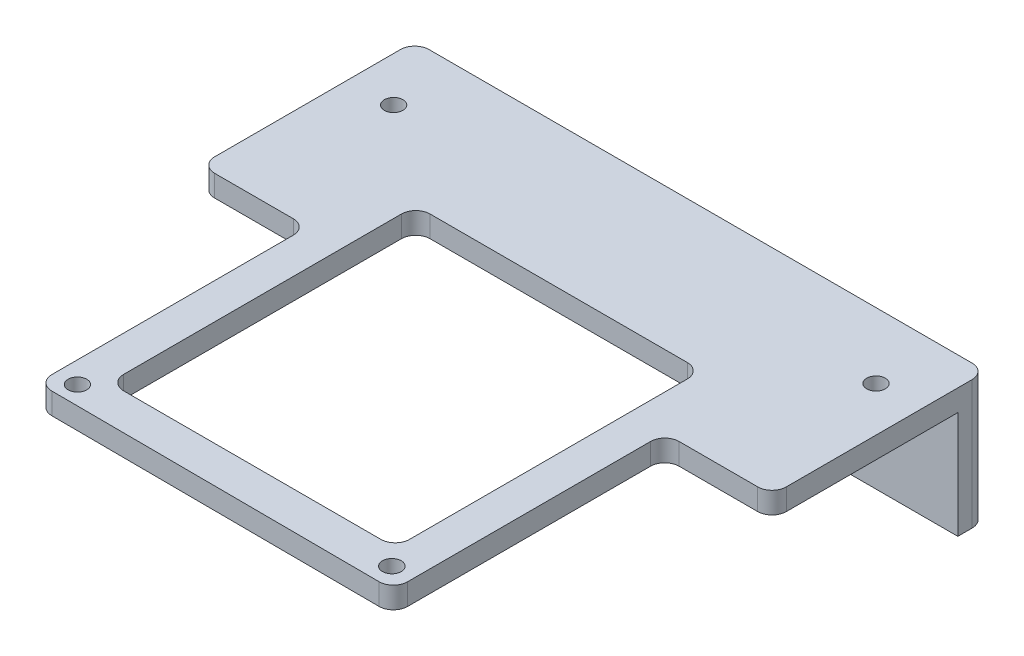
ISO-10303-21;
HEADER;
FILE_DESCRIPTION(('STEP AP214'),'2;1');
FILE_NAME('part.step','',(''),(''),'','','');
FILE_SCHEMA(('AUTOMOTIVE_DESIGN { 1 0 10303 214 1 1 1 1 }'));
ENDSEC;
DATA;
#1=APPLICATION_CONTEXT('core data for automotive mechanical design processes');
#2=APPLICATION_PROTOCOL_DEFINITION('international standard','automotive_design',2000,#1);
#3=PRODUCT_CONTEXT('',#1,'mechanical');
#4=PRODUCT('Part','Part','',(#3));
#5=PRODUCT_RELATED_PRODUCT_CATEGORY('part','',(#4));
#6=PRODUCT_DEFINITION_FORMATION('','',#4);
#7=PRODUCT_DEFINITION_CONTEXT('part definition',#1,'design');
#8=PRODUCT_DEFINITION('design','',#6,#7);
#9=PRODUCT_DEFINITION_SHAPE('','',#8);
#10=(LENGTH_UNIT() NAMED_UNIT(*) SI_UNIT(.MILLI.,.METRE.));
#11=(NAMED_UNIT(*) PLANE_ANGLE_UNIT() SI_UNIT($,.RADIAN.));
#12=(NAMED_UNIT(*) SI_UNIT($,.STERADIAN.) SOLID_ANGLE_UNIT());
#13=UNCERTAINTY_MEASURE_WITH_UNIT(LENGTH_MEASURE(1.E-05),#10,'distance_accuracy_value','');
#14=(GEOMETRIC_REPRESENTATION_CONTEXT(3) GLOBAL_UNCERTAINTY_ASSIGNED_CONTEXT((#13)) GLOBAL_UNIT_ASSIGNED_CONTEXT((#10,
#11,#12)) REPRESENTATION_CONTEXT('',''));
#15=CARTESIAN_POINT('',(0.,0.,0.));
#16=DIRECTION('',(0.,0.,1.));
#17=DIRECTION('',(1.,0.,0.));
#18=AXIS2_PLACEMENT_3D('',#15,#16,#17);
#19=CARTESIAN_POINT('',(38.,-3.,-34.5));
#20=DIRECTION('',(0.,-1.,0.));
#21=DIRECTION('',(0.,0.,-1.));
#22=AXIS2_PLACEMENT_3D('',#19,#20,#21);
#23=PLANE('',#22);
#24=DIRECTION('',(-1.,0.,0.));
#25=VECTOR('',#24,1.);
#26=CARTESIAN_POINT('',(-40.,-3.,-32.5));
#27=LINE('',#26,#25);
#28=CARTESIAN_POINT('',(40.,-3.,-32.5));
#29=VERTEX_POINT('',#28);
#30=CARTESIAN_POINT('',(-40.,-3.,-32.5));
#31=VERTEX_POINT('',#30);
#32=EDGE_CURVE('E54',#29,#31,#27,.T.);
#33=ORIENTED_EDGE('',*,*,#32,.F.);
#34=DIRECTION('',(0.,0.,1.));
#35=VECTOR('',#34,1.);
#36=CARTESIAN_POINT('',(40.,-3.,-34.5));
#37=LINE('',#36,#35);
#38=CARTESIAN_POINT('',(40.,-3.,-8.49999999999999));
#39=VERTEX_POINT('',#38);
#40=EDGE_CURVE('E356',#29,#39,#37,.T.);
#41=ORIENTED_EDGE('',*,*,#40,.T.);
#42=CARTESIAN_POINT('',(38.,-3.,-8.49999999999999));
#43=DIRECTION('',(0.,-1.,0.));
#44=DIRECTION('',(0.,0.,-1.));
#45=AXIS2_PLACEMENT_3D('',#42,#43,#44);
#46=CIRCLE('',#45,2.);
#47=CARTESIAN_POINT('',(38.,-3.,-6.49999999999999));
#48=VERTEX_POINT('',#47);
#49=EDGE_CURVE('E359',#39,#48,#46,.T.);
#50=ORIENTED_EDGE('',*,*,#49,.T.);
#51=DIRECTION('',(-1.,0.,0.));
#52=VECTOR('',#51,1.);
#53=CARTESIAN_POINT('',(38.,-3.,-6.49999999999999));
#54=LINE('',#53,#52);
#55=CARTESIAN_POINT('',(27.,-3.,-6.49999999999999));
#56=VERTEX_POINT('',#55);
#57=EDGE_CURVE('E363',#48,#56,#54,.T.);
#58=ORIENTED_EDGE('',*,*,#57,.T.);
#59=CARTESIAN_POINT('',(27.,-3.,-4.49999999999999));
#60=DIRECTION('',(0.,1.,0.));
#61=DIRECTION('',(0.,0.,-1.));
#62=AXIS2_PLACEMENT_3D('',#59,#60,#61);
#63=CIRCLE('',#62,2.);
#64=CARTESIAN_POINT('',(25.,-3.,-4.49999999999999));
#65=VERTEX_POINT('',#64);
#66=EDGE_CURVE('E366',#56,#65,#63,.T.);
#67=ORIENTED_EDGE('',*,*,#66,.T.);
#68=DIRECTION('',(0.,0.,1.));
#69=VECTOR('',#68,1.);
#70=CARTESIAN_POINT('',(25.,-3.,-4.49999999999999));
#71=LINE('',#70,#69);
#72=CARTESIAN_POINT('',(25.,-3.,29.4906585885515));
#73=VERTEX_POINT('',#72);
#74=EDGE_CURVE('E369',#65,#73,#71,.T.);
#75=ORIENTED_EDGE('',*,*,#74,.T.);
#76=CARTESIAN_POINT('',(23.,-3.,29.4906585885515));
#77=DIRECTION('',(0.,-1.,0.));
#78=DIRECTION('',(0.,0.,1.));
#79=AXIS2_PLACEMENT_3D('',#76,#77,#78);
#80=CIRCLE('',#79,2.);
#81=CARTESIAN_POINT('',(22.9906804038066,-3.,31.4906368747154));
#82=VERTEX_POINT('',#81);
#83=EDGE_CURVE('E372',#73,#82,#80,.T.);
#84=ORIENTED_EDGE('',*,*,#83,.T.);
#85=DIRECTION('',(-0.999989143081913,0.,-0.00465979809667995));
#86=VECTOR('',#85,1.);
#87=CARTESIAN_POINT('',(-23.0093195961933,-3.,31.2762838350547));
#88=LINE('',#87,#86);
#89=CARTESIAN_POINT('',(-23.0093195961933,-3.,31.2762838350547));
#90=VERTEX_POINT('',#89);
#91=EDGE_CURVE('E375',#82,#90,#88,.T.);
#92=ORIENTED_EDGE('',*,*,#91,.T.);
#93=CARTESIAN_POINT('',(-23.,-3.,29.2763055488909));
#94=DIRECTION('',(0.,-1.,0.));
#95=DIRECTION('',(0.,0.,-1.));
#96=AXIS2_PLACEMENT_3D('',#93,#94,#95);
#97=CIRCLE('',#96,2.);
#98=CARTESIAN_POINT('',(-25.,-3.,29.2763055488908));
#99=VERTEX_POINT('',#98);
#100=EDGE_CURVE('E378',#90,#99,#97,.T.);
#101=ORIENTED_EDGE('',*,*,#100,.T.);
#102=DIRECTION('',(0.,0.,-1.));
#103=VECTOR('',#102,1.);
#104=CARTESIAN_POINT('',(-25.,-3.,-4.5));
#105=LINE('',#104,#103);
#106=CARTESIAN_POINT('',(-25.,-3.,-4.5));
#107=VERTEX_POINT('',#106);
#108=EDGE_CURVE('E381',#99,#107,#105,.T.);
#109=ORIENTED_EDGE('',*,*,#108,.T.);
#110=CARTESIAN_POINT('',(-27.,-3.,-4.5));
#111=DIRECTION('',(0.,1.,0.));
#112=DIRECTION('',(0.,0.,1.));
#113=AXIS2_PLACEMENT_3D('',#110,#111,#112);
#114=CIRCLE('',#113,2.);
#115=CARTESIAN_POINT('',(-27.,-3.,-6.5));
#116=VERTEX_POINT('',#115);
#117=EDGE_CURVE('E384',#107,#116,#114,.T.);
#118=ORIENTED_EDGE('',*,*,#117,.T.);
#119=DIRECTION('',(-1.,0.,0.));
#120=VECTOR('',#119,1.);
#121=CARTESIAN_POINT('',(-27.,-3.,-6.5));
#122=LINE('',#121,#120);
#123=CARTESIAN_POINT('',(-38.,-3.,-6.49999999999999));
#124=VERTEX_POINT('',#123);
#125=EDGE_CURVE('E387',#116,#124,#122,.T.);
#126=ORIENTED_EDGE('',*,*,#125,.T.);
#127=CARTESIAN_POINT('',(-38.,-3.,-8.5));
#128=DIRECTION('',(0.,-1.,0.));
#129=DIRECTION('',(0.,0.,-1.));
#130=AXIS2_PLACEMENT_3D('',#127,#128,#129);
#131=CIRCLE('',#130,2.);
#132=CARTESIAN_POINT('',(-40.,-3.,-8.5));
#133=VERTEX_POINT('',#132);
#134=EDGE_CURVE('E390',#124,#133,#131,.T.);
#135=ORIENTED_EDGE('',*,*,#134,.T.);
#136=DIRECTION('',(0.,0.,-1.));
#137=VECTOR('',#136,1.);
#138=CARTESIAN_POINT('',(-40.,-3.,-34.5));
#139=LINE('',#138,#137);
#140=EDGE_CURVE('E393',#133,#31,#139,.T.);
#141=ORIENTED_EDGE('',*,*,#140,.T.);
#142=EDGE_LOOP('',(#33,#41,#50,#58,#67,#75,#84,#92,#101,#109,#118,#126,#135,#141));
#143=FACE_BOUND('',#142,.T.);
#144=CARTESIAN_POINT('',(-18.,-3.,-14.6434212450301));
#145=DIRECTION('',(0.,-1.,0.));
#146=DIRECTION('',(0.,0.,-1.));
#147=AXIS2_PLACEMENT_3D('',#144,#145,#146);
#148=CIRCLE('',#147,2.);
#149=CARTESIAN_POINT('',(-20.,-3.,-14.6434212450301));
#150=VERTEX_POINT('',#149);
#151=CARTESIAN_POINT('',(-18.,-3.,-16.6434212450301));
#152=VERTEX_POINT('',#151);
#153=EDGE_CURVE('E62',#150,#152,#148,.T.);
#154=ORIENTED_EDGE('',*,*,#153,.F.);
#155=DIRECTION('',(0.,0.,-1.));
#156=VECTOR('',#155,1.);
#157=CARTESIAN_POINT('',(-20.,-3.,24.2336647871814));
#158=LINE('',#157,#156);
#159=CARTESIAN_POINT('',(-20.,-3.,24.2336647871814));
#160=VERTEX_POINT('',#159);
#161=EDGE_CURVE('E295',#160,#150,#158,.T.);
#162=ORIENTED_EDGE('',*,*,#161,.F.);
#163=CARTESIAN_POINT('',(-18.,-3.,24.2336647871814));
#164=DIRECTION('',(0.,-1.,0.));
#165=DIRECTION('',(0.,0.,-1.));
#166=AXIS2_PLACEMENT_3D('',#163,#164,#165);
#167=CIRCLE('',#166,2.);
#168=CARTESIAN_POINT('',(-18.,-3.,26.2336647871814));
#169=VERTEX_POINT('',#168);
#170=EDGE_CURVE('E291',#169,#160,#167,.T.);
#171=ORIENTED_EDGE('',*,*,#170,.F.);
#172=DIRECTION('',(-1.,0.,0.));
#173=VECTOR('',#172,1.);
#174=CARTESIAN_POINT('',(-18.,-3.,26.2336647871814));
#175=LINE('',#174,#173);
#176=CARTESIAN_POINT('',(18.,-3.,26.2336647871814));
#177=VERTEX_POINT('',#176);
#178=EDGE_CURVE('E287',#177,#169,#175,.T.);
#179=ORIENTED_EDGE('',*,*,#178,.F.);
#180=CARTESIAN_POINT('',(18.,-3.,24.2336647871814));
#181=DIRECTION('',(0.,-1.,0.));
#182=DIRECTION('',(0.,0.,1.));
#183=AXIS2_PLACEMENT_3D('',#180,#181,#182);
#184=CIRCLE('',#183,2.);
#185=CARTESIAN_POINT('',(20.,-3.,24.2336647871814));
#186=VERTEX_POINT('',#185);
#187=EDGE_CURVE('E284',#186,#177,#184,.T.);
#188=ORIENTED_EDGE('',*,*,#187,.F.);
#189=DIRECTION('',(0.,0.,1.));
#190=VECTOR('',#189,1.);
#191=CARTESIAN_POINT('',(20.,-3.,24.2336647871814));
#192=LINE('',#191,#190);
#193=CARTESIAN_POINT('',(20.,-3.,-14.6434212450301));
#194=VERTEX_POINT('',#193);
#195=EDGE_CURVE('E280',#194,#186,#192,.T.);
#196=ORIENTED_EDGE('',*,*,#195,.F.);
#197=CARTESIAN_POINT('',(18.,-3.,-14.6434212450301));
#198=DIRECTION('',(0.,-1.,0.));
#199=DIRECTION('',(0.,0.,-1.));
#200=AXIS2_PLACEMENT_3D('',#197,#198,#199);
#201=CIRCLE('',#200,2.);
#202=CARTESIAN_POINT('',(18.,-3.,-16.6434212450301));
#203=VERTEX_POINT('',#202);
#204=EDGE_CURVE('E276',#203,#194,#201,.T.);
#205=ORIENTED_EDGE('',*,*,#204,.F.);
#206=DIRECTION('',(1.,0.,0.));
#207=VECTOR('',#206,1.);
#208=CARTESIAN_POINT('',(-18.,-3.,-16.6434212450301));
#209=LINE('',#208,#207);
#210=EDGE_CURVE('E272',#152,#203,#209,.T.);
#211=ORIENTED_EDGE('',*,*,#210,.F.);
#212=EDGE_LOOP('',(#154,#162,#171,#179,#188,#196,#205,#211));
#213=FACE_BOUND('',#212,.T.);
#214=CARTESIAN_POINT('',(33.75,-3.,-27.3));
#215=DIRECTION('',(0.,-1.,0.));
#216=DIRECTION('',(0.,0.,-1.));
#217=AXIS2_PLACEMENT_3D('',#214,#215,#216);
#218=CIRCLE('',#217,1.3);
#219=CARTESIAN_POINT('',(33.75,-3.,-28.6));
#220=VERTEX_POINT('',#219);
#221=EDGE_CURVE('E332',#220,#220,#218,.T.);
#222=ORIENTED_EDGE('',*,*,#221,.F.);
#223=EDGE_LOOP('',(#222));
#224=FACE_BOUND('',#223,.T.);
#225=CARTESIAN_POINT('',(-22.,-3.,28.7));
#226=DIRECTION('',(0.,-1.,0.));
#227=DIRECTION('',(0.,0.,-1.));
#228=AXIS2_PLACEMENT_3D('',#225,#226,#227);
#229=CIRCLE('',#228,1.3);
#230=CARTESIAN_POINT('',(-22.,-3.,27.4));
#231=VERTEX_POINT('',#230);
#232=EDGE_CURVE('E348',#231,#231,#229,.T.);
#233=ORIENTED_EDGE('',*,*,#232,.F.);
#234=EDGE_LOOP('',(#233));
#235=FACE_BOUND('',#234,.T.);
#236=CARTESIAN_POINT('',(-33.75,-3.,-27.3));
#237=DIRECTION('',(0.,-1.,0.));
#238=DIRECTION('',(0.,0.,-1.));
#239=AXIS2_PLACEMENT_3D('',#236,#237,#238);
#240=CIRCLE('',#239,1.3);
#241=CARTESIAN_POINT('',(-33.75,-3.,-28.6));
#242=VERTEX_POINT('',#241);
#243=EDGE_CURVE('E340',#242,#242,#240,.T.);
#244=ORIENTED_EDGE('',*,*,#243,.F.);
#245=EDGE_LOOP('',(#244));
#246=FACE_BOUND('',#245,.T.);
#247=CARTESIAN_POINT('',(22.0090808771113,-3.,28.7123449315462));
#248=DIRECTION('',(0.,-1.,0.));
#249=DIRECTION('',(0.,0.,-1.));
#250=AXIS2_PLACEMENT_3D('',#247,#248,#249);
#251=CIRCLE('',#250,1.31532513177729);
#252=CARTESIAN_POINT('',(22.0090808771113,-3.,27.3970197997689));
#253=VERTEX_POINT('',#252);
#254=EDGE_CURVE('E324',#253,#253,#251,.T.);
#255=ORIENTED_EDGE('',*,*,#254,.F.);
#256=EDGE_LOOP('',(#255));
#257=FACE_BOUND('',#256,.T.);
#258=ADVANCED_FACE('F38',(#143,#213,#224,#235,#246,#257),#23,.T.);
#259=CARTESIAN_POINT('',(38.,0.,-34.5));
#260=DIRECTION('',(0.,-1.,0.));
#261=DIRECTION('',(0.,0.,-1.));
#262=AXIS2_PLACEMENT_3D('',#259,#260,#261);
#263=PLANE('',#262);
#264=DIRECTION('',(0.,0.,-1.));
#265=VECTOR('',#264,1.);
#266=CARTESIAN_POINT('',(-20.,0.,-34.5));
#267=LINE('',#266,#265);
#268=CARTESIAN_POINT('',(-20.,0.,24.2336647871814));
#269=VERTEX_POINT('',#268);
#270=CARTESIAN_POINT('',(-20.,0.,-14.6434212450301));
#271=VERTEX_POINT('',#270);
#272=EDGE_CURVE('E47',#269,#271,#267,.T.);
#273=ORIENTED_EDGE('',*,*,#272,.T.);
#274=CARTESIAN_POINT('',(-18.,0.,-14.6434212450301));
#275=DIRECTION('',(0.,-1.,0.));
#276=DIRECTION('',(0.,0.,-1.));
#277=AXIS2_PLACEMENT_3D('',#274,#275,#276);
#278=CIRCLE('',#277,2.);
#279=CARTESIAN_POINT('',(-18.,0.,-16.6434212450301));
#280=VERTEX_POINT('',#279);
#281=EDGE_CURVE('E11',#271,#280,#278,.T.);
#282=ORIENTED_EDGE('',*,*,#281,.T.);
#283=DIRECTION('',(1.,0.,0.));
#284=VECTOR('',#283,1.);
#285=CARTESIAN_POINT('',(38.,0.,-16.6434212450301));
#286=LINE('',#285,#284);
#287=CARTESIAN_POINT('',(18.,0.,-16.6434212450301));
#288=VERTEX_POINT('',#287);
#289=EDGE_CURVE('E497',#280,#288,#286,.T.);
#290=ORIENTED_EDGE('',*,*,#289,.T.);
#291=CARTESIAN_POINT('',(18.,0.,-14.6434212450301));
#292=DIRECTION('',(0.,-1.,0.));
#293=DIRECTION('',(0.,0.,-1.));
#294=AXIS2_PLACEMENT_3D('',#291,#292,#293);
#295=CIRCLE('',#294,2.);
#296=CARTESIAN_POINT('',(20.,0.,-14.6434212450301));
#297=VERTEX_POINT('',#296);
#298=EDGE_CURVE('E501',#288,#297,#295,.T.);
#299=ORIENTED_EDGE('',*,*,#298,.T.);
#300=DIRECTION('',(0.,0.,1.));
#301=VECTOR('',#300,1.);
#302=CARTESIAN_POINT('',(20.,0.,-34.5));
#303=LINE('',#302,#301);
#304=CARTESIAN_POINT('',(20.,0.,24.2336647871814));
#305=VERTEX_POINT('',#304);
#306=EDGE_CURVE('E505',#297,#305,#303,.T.);
#307=ORIENTED_EDGE('',*,*,#306,.T.);
#308=CARTESIAN_POINT('',(18.,0.,24.2336647871814));
#309=DIRECTION('',(0.,-1.,0.));
#310=DIRECTION('',(0.,0.,-1.));
#311=AXIS2_PLACEMENT_3D('',#308,#309,#310);
#312=CIRCLE('',#311,2.);
#313=CARTESIAN_POINT('',(18.,0.,26.2336647871814));
#314=VERTEX_POINT('',#313);
#315=EDGE_CURVE('E509',#305,#314,#312,.T.);
#316=ORIENTED_EDGE('',*,*,#315,.T.);
#317=DIRECTION('',(-1.,0.,0.));
#318=VECTOR('',#317,1.);
#319=CARTESIAN_POINT('',(38.,0.,26.2336647871814));
#320=LINE('',#319,#318);
#321=CARTESIAN_POINT('',(-18.,0.,26.2336647871814));
#322=VERTEX_POINT('',#321);
#323=EDGE_CURVE('E513',#314,#322,#320,.T.);
#324=ORIENTED_EDGE('',*,*,#323,.T.);
#325=CARTESIAN_POINT('',(-18.,0.,24.2336647871814));
#326=DIRECTION('',(0.,-1.,0.));
#327=DIRECTION('',(0.,0.,-1.));
#328=AXIS2_PLACEMENT_3D('',#325,#326,#327);
#329=CIRCLE('',#328,2.);
#330=EDGE_CURVE('E517',#322,#269,#329,.T.);
#331=ORIENTED_EDGE('',*,*,#330,.T.);
#332=EDGE_LOOP('',(#273,#282,#290,#299,#307,#316,#324,#331));
#333=FACE_BOUND('',#332,.T.);
#334=CARTESIAN_POINT('',(38.,0.,-34.5));
#335=DIRECTION('',(0.,-1.,0.));
#336=DIRECTION('',(0.,0.,-1.));
#337=AXIS2_PLACEMENT_3D('',#334,#335,#336);
#338=CIRCLE('',#337,1.99999999999999);
#339=CARTESIAN_POINT('',(38.,0.,-36.5));
#340=VERTEX_POINT('',#339);
#341=CARTESIAN_POINT('',(40.,0.,-34.5));
#342=VERTEX_POINT('',#341);
#343=EDGE_CURVE('E352',#340,#342,#338,.T.);
#344=ORIENTED_EDGE('',*,*,#343,.F.);
#345=DIRECTION('',(1.,0.,0.));
#346=VECTOR('',#345,1.);
#347=CARTESIAN_POINT('',(38.,0.,-36.5));
#348=LINE('',#347,#346);
#349=CARTESIAN_POINT('',(-38.,0.,-36.5));
#350=VERTEX_POINT('',#349);
#351=EDGE_CURVE('E360',#350,#340,#348,.T.);
#352=ORIENTED_EDGE('',*,*,#351,.F.);
#353=CARTESIAN_POINT('',(-38.,0.,-34.5));
#354=DIRECTION('',(0.,-1.,0.));
#355=DIRECTION('',(0.,0.,1.));
#356=AXIS2_PLACEMENT_3D('',#353,#354,#355);
#357=CIRCLE('',#356,2.00000000000001);
#358=CARTESIAN_POINT('',(-40.,0.,-34.5));
#359=VERTEX_POINT('',#358);
#360=EDGE_CURVE('E438',#359,#350,#357,.T.);
#361=ORIENTED_EDGE('',*,*,#360,.F.);
#362=DIRECTION('',(0.,0.,-1.));
#363=VECTOR('',#362,1.);
#364=CARTESIAN_POINT('',(-40.,0.,-34.5));
#365=LINE('',#364,#363);
#366=CARTESIAN_POINT('',(-40.,0.,-8.5));
#367=VERTEX_POINT('',#366);
#368=EDGE_CURVE('E221',#367,#359,#365,.T.);
#369=ORIENTED_EDGE('',*,*,#368,.F.);
#370=CARTESIAN_POINT('',(-38.,0.,-8.5));
#371=DIRECTION('',(0.,-1.,0.));
#372=DIRECTION('',(0.,0.,-1.));
#373=AXIS2_PLACEMENT_3D('',#370,#371,#372);
#374=CIRCLE('',#373,2.);
#375=CARTESIAN_POINT('',(-38.,0.,-6.49999999999999));
#376=VERTEX_POINT('',#375);
#377=EDGE_CURVE('E433',#376,#367,#374,.T.);
#378=ORIENTED_EDGE('',*,*,#377,.F.);
#379=DIRECTION('',(-1.,0.,0.));
#380=VECTOR('',#379,1.);
#381=CARTESIAN_POINT('',(-27.,0.,-6.5));
#382=LINE('',#381,#380);
#383=CARTESIAN_POINT('',(-27.,0.,-6.5));
#384=VERTEX_POINT('',#383);
#385=EDGE_CURVE('E430',#384,#376,#382,.T.);
#386=ORIENTED_EDGE('',*,*,#385,.F.);
#387=CARTESIAN_POINT('',(-27.,0.,-4.5));
#388=DIRECTION('',(0.,1.,0.));
#389=DIRECTION('',(0.,0.,1.));
#390=AXIS2_PLACEMENT_3D('',#387,#388,#389);
#391=CIRCLE('',#390,2.);
#392=CARTESIAN_POINT('',(-25.,0.,-4.5));
#393=VERTEX_POINT('',#392);
#394=EDGE_CURVE('E427',#393,#384,#391,.T.);
#395=ORIENTED_EDGE('',*,*,#394,.F.);
#396=DIRECTION('',(0.,0.,-1.));
#397=VECTOR('',#396,1.);
#398=CARTESIAN_POINT('',(-25.,0.,-4.5));
#399=LINE('',#398,#397);
#400=CARTESIAN_POINT('',(-25.,0.,29.2763055488908));
#401=VERTEX_POINT('',#400);
#402=EDGE_CURVE('E424',#401,#393,#399,.T.);
#403=ORIENTED_EDGE('',*,*,#402,.F.);
#404=CARTESIAN_POINT('',(-23.,0.,29.2763055488909));
#405=DIRECTION('',(0.,-1.,0.));
#406=DIRECTION('',(0.,0.,-1.));
#407=AXIS2_PLACEMENT_3D('',#404,#405,#406);
#408=CIRCLE('',#407,2.);
#409=CARTESIAN_POINT('',(-23.0093195961933,0.,31.2762838350547));
#410=VERTEX_POINT('',#409);
#411=EDGE_CURVE('E421',#410,#401,#408,.T.);
#412=ORIENTED_EDGE('',*,*,#411,.F.);
#413=DIRECTION('',(-0.999989143081913,0.,-0.00465979809667995));
#414=VECTOR('',#413,1.);
#415=CARTESIAN_POINT('',(-23.0093195961933,0.,31.2762838350547));
#416=LINE('',#415,#414);
#417=CARTESIAN_POINT('',(22.9906804038066,0.,31.4906368747154));
#418=VERTEX_POINT('',#417);
#419=EDGE_CURVE('E418',#418,#410,#416,.T.);
#420=ORIENTED_EDGE('',*,*,#419,.F.);
#421=CARTESIAN_POINT('',(23.,0.,29.4906585885515));
#422=DIRECTION('',(0.,-1.,0.));
#423=DIRECTION('',(0.,0.,1.));
#424=AXIS2_PLACEMENT_3D('',#421,#422,#423);
#425=CIRCLE('',#424,2.);
#426=CARTESIAN_POINT('',(25.,0.,29.4906585885515));
#427=VERTEX_POINT('',#426);
#428=EDGE_CURVE('E415',#427,#418,#425,.T.);
#429=ORIENTED_EDGE('',*,*,#428,.F.);
#430=DIRECTION('',(0.,0.,1.));
#431=VECTOR('',#430,1.);
#432=CARTESIAN_POINT('',(25.,0.,-4.49999999999999));
#433=LINE('',#432,#431);
#434=CARTESIAN_POINT('',(25.,0.,-4.49999999999999));
#435=VERTEX_POINT('',#434);
#436=EDGE_CURVE('E412',#435,#427,#433,.T.);
#437=ORIENTED_EDGE('',*,*,#436,.F.);
#438=CARTESIAN_POINT('',(27.,0.,-4.49999999999999));
#439=DIRECTION('',(0.,1.,0.));
#440=DIRECTION('',(0.,0.,-1.));
#441=AXIS2_PLACEMENT_3D('',#438,#439,#440);
#442=CIRCLE('',#441,2.);
#443=CARTESIAN_POINT('',(27.,0.,-6.49999999999999));
#444=VERTEX_POINT('',#443);
#445=EDGE_CURVE('E409',#444,#435,#442,.T.);
#446=ORIENTED_EDGE('',*,*,#445,.F.);
#447=DIRECTION('',(-1.,0.,0.));
#448=VECTOR('',#447,1.);
#449=CARTESIAN_POINT('',(38.,0.,-6.49999999999999));
#450=LINE('',#449,#448);
#451=CARTESIAN_POINT('',(38.,0.,-6.49999999999999));
#452=VERTEX_POINT('',#451);
#453=EDGE_CURVE('E406',#452,#444,#450,.T.);
#454=ORIENTED_EDGE('',*,*,#453,.F.);
#455=CARTESIAN_POINT('',(38.,0.,-8.49999999999999));
#456=DIRECTION('',(0.,-1.,0.));
#457=DIRECTION('',(0.,0.,-1.));
#458=AXIS2_PLACEMENT_3D('',#455,#456,#457);
#459=CIRCLE('',#458,2.);
#460=CARTESIAN_POINT('',(40.,0.,-8.49999999999999));
#461=VERTEX_POINT('',#460);
#462=EDGE_CURVE('E403',#461,#452,#459,.T.);
#463=ORIENTED_EDGE('',*,*,#462,.F.);
#464=DIRECTION('',(0.,0.,1.));
#465=VECTOR('',#464,1.);
#466=CARTESIAN_POINT('',(40.,0.,-34.5));
#467=LINE('',#466,#465);
#468=EDGE_CURVE('E400',#342,#461,#467,.T.);
#469=ORIENTED_EDGE('',*,*,#468,.F.);
#470=EDGE_LOOP('',(#344,#352,#361,#369,#378,#386,#395,#403,#412,#420,#429,#437,#446,#454,#463,#469));
#471=FACE_BOUND('',#470,.T.);
#472=CARTESIAN_POINT('',(-22.,0.,28.7));
#473=DIRECTION('',(0.,-1.,0.));
#474=DIRECTION('',(0.,0.,-1.));
#475=AXIS2_PLACEMENT_3D('',#472,#473,#474);
#476=CIRCLE('',#475,1.3);
#477=CARTESIAN_POINT('',(-22.,0.,27.4));
#478=VERTEX_POINT('',#477);
#479=EDGE_CURVE('E344',#478,#478,#476,.T.);
#480=ORIENTED_EDGE('',*,*,#479,.T.);
#481=EDGE_LOOP('',(#480));
#482=FACE_BOUND('',#481,.T.);
#483=CARTESIAN_POINT('',(-33.75,0.,-27.3));
#484=DIRECTION('',(0.,-1.,0.));
#485=DIRECTION('',(0.,0.,-1.));
#486=AXIS2_PLACEMENT_3D('',#483,#484,#485);
#487=CIRCLE('',#486,1.3);
#488=CARTESIAN_POINT('',(-33.75,0.,-28.6));
#489=VERTEX_POINT('',#488);
#490=EDGE_CURVE('E336',#489,#489,#487,.T.);
#491=ORIENTED_EDGE('',*,*,#490,.T.);
#492=EDGE_LOOP('',(#491));
#493=FACE_BOUND('',#492,.T.);
#494=CARTESIAN_POINT('',(33.75,0.,-27.3));
#495=DIRECTION('',(0.,-1.,0.));
#496=DIRECTION('',(0.,0.,-1.));
#497=AXIS2_PLACEMENT_3D('',#494,#495,#496);
#498=CIRCLE('',#497,1.3);
#499=CARTESIAN_POINT('',(33.75,0.,-28.6));
#500=VERTEX_POINT('',#499);
#501=EDGE_CURVE('E328',#500,#500,#498,.T.);
#502=ORIENTED_EDGE('',*,*,#501,.T.);
#503=EDGE_LOOP('',(#502));
#504=FACE_BOUND('',#503,.T.);
#505=CARTESIAN_POINT('',(22.0090808771113,0.,28.7123449315462));
#506=DIRECTION('',(0.,-1.,0.));
#507=DIRECTION('',(0.,0.,-1.));
#508=AXIS2_PLACEMENT_3D('',#505,#506,#507);
#509=CIRCLE('',#508,1.31532513177729);
#510=CARTESIAN_POINT('',(22.0090808771113,0.,27.3970197997689));
#511=VERTEX_POINT('',#510);
#512=EDGE_CURVE('E303',#511,#511,#509,.T.);
#513=ORIENTED_EDGE('',*,*,#512,.T.);
#514=EDGE_LOOP('',(#513));
#515=FACE_BOUND('',#514,.T.);
#516=ADVANCED_FACE('F523',(#333,#471,#482,#493,#504,#515),#263,.F.);
#517=CARTESIAN_POINT('',(38.,-3.,-34.5));
#518=DIRECTION('',(0.,1.,0.));
#519=DIRECTION('',(0.,0.,1.));
#520=AXIS2_PLACEMENT_3D('',#517,#518,#519);
#521=CYLINDRICAL_SURFACE('',#520,1.99999999999999);
#522=ORIENTED_EDGE('',*,*,#343,.T.);
#523=DIRECTION('',(0.,1.,0.));
#524=VECTOR('',#523,1.);
#525=CARTESIAN_POINT('',(40.,-3.,-34.5));
#526=LINE('',#525,#524);
#527=CARTESIAN_POINT('',(40.,-18.,-34.5));
#528=VERTEX_POINT('',#527);
#529=EDGE_CURVE('E493',#528,#342,#526,.T.);
#530=ORIENTED_EDGE('',*,*,#529,.F.);
#531=CARTESIAN_POINT('',(38.,-18.,-34.5));
#532=DIRECTION('',(0.,-1.,0.));
#533=DIRECTION('',(0.,0.,-1.));
#534=AXIS2_PLACEMENT_3D('',#531,#532,#533);
#535=CIRCLE('',#534,2.);
#536=CARTESIAN_POINT('',(38.,-18.,-36.5));
#537=VERTEX_POINT('',#536);
#538=EDGE_CURVE('E254',#537,#528,#535,.T.);
#539=ORIENTED_EDGE('',*,*,#538,.F.);
#540=DIRECTION('',(0.,1.,0.));
#541=VECTOR('',#540,1.);
#542=CARTESIAN_POINT('',(38.,-3.,-36.5));
#543=LINE('',#542,#541);
#544=EDGE_CURVE('E396',#537,#340,#543,.T.);
#545=ORIENTED_EDGE('',*,*,#544,.T.);
#546=EDGE_LOOP('',(#522,#530,#539,#545));
#547=FACE_BOUND('',#546,.T.);
#548=ADVANCED_FACE('F40',(#547),#521,.T.);
#549=CARTESIAN_POINT('',(40.,-3.,-34.5));
#550=DIRECTION('',(-1.,0.,0.));
#551=DIRECTION('',(0.,0.,1.));
#552=AXIS2_PLACEMENT_3D('',#549,#550,#551);
#553=PLANE('',#552);
#554=ORIENTED_EDGE('',*,*,#468,.T.);
#555=DIRECTION('',(0.,1.,0.));
#556=VECTOR('',#555,1.);
#557=CARTESIAN_POINT('',(40.,-3.,-8.49999999999999));
#558=LINE('',#557,#556);
#559=EDGE_CURVE('E489',#39,#461,#558,.T.);
#560=ORIENTED_EDGE('',*,*,#559,.F.);
#561=ORIENTED_EDGE('',*,*,#40,.F.);
#562=DIRECTION('',(0.,1.,0.));
#563=VECTOR('',#562,1.);
#564=CARTESIAN_POINT('',(40.,-18.,-32.5));
#565=LINE('',#564,#563);
#566=CARTESIAN_POINT('',(40.,-18.,-32.5));
#567=VERTEX_POINT('',#566);
#568=EDGE_CURVE('E266',#567,#29,#565,.T.);
#569=ORIENTED_EDGE('',*,*,#568,.F.);
#570=DIRECTION('',(0.,0.,1.));
#571=VECTOR('',#570,1.);
#572=CARTESIAN_POINT('',(40.,-18.,-32.5));
#573=LINE('',#572,#571);
#574=EDGE_CURVE('E258',#528,#567,#573,.T.);
#575=ORIENTED_EDGE('',*,*,#574,.F.);
#576=ORIENTED_EDGE('',*,*,#529,.T.);
#577=EDGE_LOOP('',(#554,#560,#561,#569,#575,#576));
#578=FACE_BOUND('',#577,.T.);
#579=ADVANCED_FACE('F616',(#578),#553,.F.);
#580=CARTESIAN_POINT('',(38.,-3.,-8.49999999999999));
#581=DIRECTION('',(0.,1.,0.));
#582=DIRECTION('',(0.,0.,1.));
#583=AXIS2_PLACEMENT_3D('',#580,#581,#582);
#584=CYLINDRICAL_SURFACE('',#583,2.);
#585=ORIENTED_EDGE('',*,*,#462,.T.);
#586=DIRECTION('',(0.,1.,0.));
#587=VECTOR('',#586,1.);
#588=CARTESIAN_POINT('',(38.,-3.,-6.49999999999999));
#589=LINE('',#588,#587);
#590=EDGE_CURVE('E485',#48,#452,#589,.T.);
#591=ORIENTED_EDGE('',*,*,#590,.F.);
#592=ORIENTED_EDGE('',*,*,#49,.F.);
#593=ORIENTED_EDGE('',*,*,#559,.T.);
#594=EDGE_LOOP('',(#585,#591,#592,#593));
#595=FACE_BOUND('',#594,.T.);
#596=ADVANCED_FACE('F613',(#595),#584,.T.);
#597=CARTESIAN_POINT('',(38.,-3.,-6.49999999999999));
#598=DIRECTION('',(0.,0.,-1.));
#599=DIRECTION('',(-1.,0.,0.));
#600=AXIS2_PLACEMENT_3D('',#597,#598,#599);
#601=PLANE('',#600);
#602=ORIENTED_EDGE('',*,*,#453,.T.);
#603=DIRECTION('',(0.,1.,0.));
#604=VECTOR('',#603,1.);
#605=CARTESIAN_POINT('',(27.,-3.,-6.49999999999999));
#606=LINE('',#605,#604);
#607=EDGE_CURVE('E481',#56,#444,#606,.T.);
#608=ORIENTED_EDGE('',*,*,#607,.F.);
#609=ORIENTED_EDGE('',*,*,#57,.F.);
#610=ORIENTED_EDGE('',*,*,#590,.T.);
#611=EDGE_LOOP('',(#602,#608,#609,#610));
#612=FACE_BOUND('',#611,.T.);
#613=ADVANCED_FACE('F609',(#612),#601,.F.);
#614=CARTESIAN_POINT('',(27.,-3.,-4.49999999999999));
#615=DIRECTION('',(0.,1.,0.));
#616=DIRECTION('',(0.,0.,1.));
#617=AXIS2_PLACEMENT_3D('',#614,#615,#616);
#618=CYLINDRICAL_SURFACE('',#617,2.);
#619=ORIENTED_EDGE('',*,*,#445,.T.);
#620=DIRECTION('',(0.,1.,0.));
#621=VECTOR('',#620,1.);
#622=CARTESIAN_POINT('',(25.,-3.,-4.49999999999999));
#623=LINE('',#622,#621);
#624=EDGE_CURVE('E477',#65,#435,#623,.T.);
#625=ORIENTED_EDGE('',*,*,#624,.F.);
#626=ORIENTED_EDGE('',*,*,#66,.F.);
#627=ORIENTED_EDGE('',*,*,#607,.T.);
#628=EDGE_LOOP('',(#619,#625,#626,#627));
#629=FACE_BOUND('',#628,.T.);
#630=ADVANCED_FACE('F605',(#629),#618,.F.);
#631=CARTESIAN_POINT('',(25.,-3.,-4.49999999999999));
#632=DIRECTION('',(-1.,0.,0.));
#633=DIRECTION('',(0.,0.,1.));
#634=AXIS2_PLACEMENT_3D('',#631,#632,#633);
#635=PLANE('',#634);
#636=ORIENTED_EDGE('',*,*,#436,.T.);
#637=DIRECTION('',(0.,1.,0.));
#638=VECTOR('',#637,1.);
#639=CARTESIAN_POINT('',(25.,-3.,29.4906585885515));
#640=LINE('',#639,#638);
#641=EDGE_CURVE('E473',#73,#427,#640,.T.);
#642=ORIENTED_EDGE('',*,*,#641,.F.);
#643=ORIENTED_EDGE('',*,*,#74,.F.);
#644=ORIENTED_EDGE('',*,*,#624,.T.);
#645=EDGE_LOOP('',(#636,#642,#643,#644));
#646=FACE_BOUND('',#645,.T.);
#647=ADVANCED_FACE('F601',(#646),#635,.F.);
#648=CARTESIAN_POINT('',(23.,-3.,29.4906585885515));
#649=DIRECTION('',(0.,1.,0.));
#650=DIRECTION('',(0.,0.,1.));
#651=AXIS2_PLACEMENT_3D('',#648,#649,#650);
#652=CYLINDRICAL_SURFACE('',#651,2.);
#653=ORIENTED_EDGE('',*,*,#428,.T.);
#654=DIRECTION('',(0.,1.,0.));
#655=VECTOR('',#654,1.);
#656=CARTESIAN_POINT('',(22.9906804038066,-3.,31.4906368747154));
#657=LINE('',#656,#655);
#658=EDGE_CURVE('E469',#82,#418,#657,.T.);
#659=ORIENTED_EDGE('',*,*,#658,.F.);
#660=ORIENTED_EDGE('',*,*,#83,.F.);
#661=ORIENTED_EDGE('',*,*,#641,.T.);
#662=EDGE_LOOP('',(#653,#659,#660,#661));
#663=FACE_BOUND('',#662,.T.);
#664=ADVANCED_FACE('F597',(#663),#652,.T.);
#665=CARTESIAN_POINT('',(-23.0093195961933,-3.,31.2762838350547));
#666=DIRECTION('',(0.00465979809667995,0.,-0.999989143081913));
#667=DIRECTION('',(-0.999989143081913,0.,-0.00465979809667995));
#668=AXIS2_PLACEMENT_3D('',#665,#666,#667);
#669=PLANE('',#668);
#670=ORIENTED_EDGE('',*,*,#419,.T.);
#671=DIRECTION('',(0.,1.,0.));
#672=VECTOR('',#671,1.);
#673=CARTESIAN_POINT('',(-23.0093195961933,-3.,31.2762838350547));
#674=LINE('',#673,#672);
#675=EDGE_CURVE('E465',#90,#410,#674,.T.);
#676=ORIENTED_EDGE('',*,*,#675,.F.);
#677=ORIENTED_EDGE('',*,*,#91,.F.);
#678=ORIENTED_EDGE('',*,*,#658,.T.);
#679=EDGE_LOOP('',(#670,#676,#677,#678));
#680=FACE_BOUND('',#679,.T.);
#681=ADVANCED_FACE('F593',(#680),#669,.F.);
#682=CARTESIAN_POINT('',(-23.,-3.,29.2763055488909));
#683=DIRECTION('',(0.,1.,0.));
#684=DIRECTION('',(0.,0.,1.));
#685=AXIS2_PLACEMENT_3D('',#682,#683,#684);
#686=CYLINDRICAL_SURFACE('',#685,2.);
#687=ORIENTED_EDGE('',*,*,#411,.T.);
#688=DIRECTION('',(0.,1.,0.));
#689=VECTOR('',#688,1.);
#690=CARTESIAN_POINT('',(-25.,-3.,29.2763055488908));
#691=LINE('',#690,#689);
#692=EDGE_CURVE('E462',#99,#401,#691,.T.);
#693=ORIENTED_EDGE('',*,*,#692,.F.);
#694=ORIENTED_EDGE('',*,*,#100,.F.);
#695=ORIENTED_EDGE('',*,*,#675,.T.);
#696=EDGE_LOOP('',(#687,#693,#694,#695));
#697=FACE_BOUND('',#696,.T.);
#698=ADVANCED_FACE('F589',(#697),#686,.T.);
#699=CARTESIAN_POINT('',(-25.,-3.,-4.5));
#700=DIRECTION('',(1.,0.,0.));
#701=DIRECTION('',(0.,0.,-1.));
#702=AXIS2_PLACEMENT_3D('',#699,#700,#701);
#703=PLANE('',#702);
#704=ORIENTED_EDGE('',*,*,#402,.T.);
#705=DIRECTION('',(0.,1.,0.));
#706=VECTOR('',#705,1.);
#707=CARTESIAN_POINT('',(-25.,-3.,-4.5));
#708=LINE('',#707,#706);
#709=EDGE_CURVE('E458',#107,#393,#708,.T.);
#710=ORIENTED_EDGE('',*,*,#709,.F.);
#711=ORIENTED_EDGE('',*,*,#108,.F.);
#712=ORIENTED_EDGE('',*,*,#692,.T.);
#713=EDGE_LOOP('',(#704,#710,#711,#712));
#714=FACE_BOUND('',#713,.T.);
#715=ADVANCED_FACE('F585',(#714),#703,.F.);
#716=CARTESIAN_POINT('',(-27.,-3.,-4.5));
#717=DIRECTION('',(0.,1.,0.));
#718=DIRECTION('',(0.,0.,1.));
#719=AXIS2_PLACEMENT_3D('',#716,#717,#718);
#720=CYLINDRICAL_SURFACE('',#719,2.);
#721=ORIENTED_EDGE('',*,*,#394,.T.);
#722=DIRECTION('',(0.,1.,0.));
#723=VECTOR('',#722,1.);
#724=CARTESIAN_POINT('',(-27.,-3.,-6.5));
#725=LINE('',#724,#723);
#726=EDGE_CURVE('E454',#116,#384,#725,.T.);
#727=ORIENTED_EDGE('',*,*,#726,.F.);
#728=ORIENTED_EDGE('',*,*,#117,.F.);
#729=ORIENTED_EDGE('',*,*,#709,.T.);
#730=EDGE_LOOP('',(#721,#727,#728,#729));
#731=FACE_BOUND('',#730,.T.);
#732=ADVANCED_FACE('F581',(#731),#720,.F.);
#733=CARTESIAN_POINT('',(-27.,-3.,-6.5));
#734=DIRECTION('',(0.,0.,-1.));
#735=DIRECTION('',(-1.,0.,0.));
#736=AXIS2_PLACEMENT_3D('',#733,#734,#735);
#737=PLANE('',#736);
#738=ORIENTED_EDGE('',*,*,#385,.T.);
#739=DIRECTION('',(0.,1.,0.));
#740=VECTOR('',#739,1.);
#741=CARTESIAN_POINT('',(-38.,-3.,-6.49999999999999));
#742=LINE('',#741,#740);
#743=EDGE_CURVE('E450',#124,#376,#742,.T.);
#744=ORIENTED_EDGE('',*,*,#743,.F.);
#745=ORIENTED_EDGE('',*,*,#125,.F.);
#746=ORIENTED_EDGE('',*,*,#726,.T.);
#747=EDGE_LOOP('',(#738,#744,#745,#746));
#748=FACE_BOUND('',#747,.T.);
#749=ADVANCED_FACE('F577',(#748),#737,.F.);
#750=CARTESIAN_POINT('',(-38.,-3.,-8.5));
#751=DIRECTION('',(0.,1.,0.));
#752=DIRECTION('',(0.,0.,1.));
#753=AXIS2_PLACEMENT_3D('',#750,#751,#752);
#754=CYLINDRICAL_SURFACE('',#753,2.);
#755=ORIENTED_EDGE('',*,*,#377,.T.);
#756=DIRECTION('',(0.,1.,0.));
#757=VECTOR('',#756,1.);
#758=CARTESIAN_POINT('',(-40.,-3.,-8.5));
#759=LINE('',#758,#757);
#760=EDGE_CURVE('E225',#133,#367,#759,.T.);
#761=ORIENTED_EDGE('',*,*,#760,.F.);
#762=ORIENTED_EDGE('',*,*,#134,.F.);
#763=ORIENTED_EDGE('',*,*,#743,.T.);
#764=EDGE_LOOP('',(#755,#761,#762,#763));
#765=FACE_BOUND('',#764,.T.);
#766=ADVANCED_FACE('F574',(#765),#754,.T.);
#767=CARTESIAN_POINT('',(-40.,-3.,-34.5));
#768=DIRECTION('',(1.,0.,0.));
#769=DIRECTION('',(0.,0.,-1.));
#770=AXIS2_PLACEMENT_3D('',#767,#768,#769);
#771=PLANE('',#770);
#772=ORIENTED_EDGE('',*,*,#368,.T.);
#773=DIRECTION('',(0.,1.,0.));
#774=VECTOR('',#773,1.);
#775=CARTESIAN_POINT('',(-40.,-3.,-34.5));
#776=LINE('',#775,#774);
#777=CARTESIAN_POINT('',(-40.,-18.,-34.5));
#778=VERTEX_POINT('',#777);
#779=EDGE_CURVE('E213',#778,#359,#776,.T.);
#780=ORIENTED_EDGE('',*,*,#779,.F.);
#781=DIRECTION('',(0.,0.,-1.));
#782=VECTOR('',#781,1.);
#783=CARTESIAN_POINT('',(-40.,-18.,-32.5));
#784=LINE('',#783,#782);
#785=CARTESIAN_POINT('',(-40.,-18.,-32.5));
#786=VERTEX_POINT('',#785);
#787=EDGE_CURVE('E218',#786,#778,#784,.T.);
#788=ORIENTED_EDGE('',*,*,#787,.F.);
#789=DIRECTION('',(0.,1.,0.));
#790=VECTOR('',#789,1.);
#791=CARTESIAN_POINT('',(-40.,-18.,-32.5));
#792=LINE('',#791,#790);
#793=EDGE_CURVE('E262',#786,#31,#792,.T.);
#794=ORIENTED_EDGE('',*,*,#793,.T.);
#795=ORIENTED_EDGE('',*,*,#140,.F.);
#796=ORIENTED_EDGE('',*,*,#760,.T.);
#797=EDGE_LOOP('',(#772,#780,#788,#794,#795,#796));
#798=FACE_BOUND('',#797,.T.);
#799=ADVANCED_FACE('F215',(#798),#771,.F.);
#800=CARTESIAN_POINT('',(-38.,-3.,-34.5));
#801=DIRECTION('',(0.,1.,0.));
#802=DIRECTION('',(0.,0.,1.));
#803=AXIS2_PLACEMENT_3D('',#800,#801,#802);
#804=CYLINDRICAL_SURFACE('',#803,2.00000000000001);
#805=ORIENTED_EDGE('',*,*,#360,.T.);
#806=DIRECTION('',(0.,1.,0.));
#807=VECTOR('',#806,1.);
#808=CARTESIAN_POINT('',(-38.,-3.,-36.5));
#809=LINE('',#808,#807);
#810=CARTESIAN_POINT('',(-38.,-18.,-36.5));
#811=VERTEX_POINT('',#810);
#812=EDGE_CURVE('E226',#811,#350,#809,.T.);
#813=ORIENTED_EDGE('',*,*,#812,.F.);
#814=CARTESIAN_POINT('',(-38.,-18.,-34.5));
#815=DIRECTION('',(0.,-1.,0.));
#816=DIRECTION('',(0.,0.,1.));
#817=AXIS2_PLACEMENT_3D('',#814,#815,#816);
#818=CIRCLE('',#817,2.);
#819=EDGE_CURVE('E229',#778,#811,#818,.T.);
#820=ORIENTED_EDGE('',*,*,#819,.F.);
#821=ORIENTED_EDGE('',*,*,#779,.T.);
#822=EDGE_LOOP('',(#805,#813,#820,#821));
#823=FACE_BOUND('',#822,.T.);
#824=ADVANCED_FACE('F230',(#823),#804,.T.);
#825=CARTESIAN_POINT('',(38.,-3.,-36.5));
#826=DIRECTION('',(0.,0.,1.));
#827=DIRECTION('',(1.,0.,0.));
#828=AXIS2_PLACEMENT_3D('',#825,#826,#827);
#829=PLANE('',#828);
#830=CARTESIAN_POINT('',(-25.,-10.5,-36.5));
#831=DIRECTION('',(0.,0.,1.));
#832=DIRECTION('',(1.,0.,0.));
#833=AXIS2_PLACEMENT_3D('',#830,#831,#832);
#834=CIRCLE('',#833,2.2);
#835=CARTESIAN_POINT('',(-22.8,-10.5,-36.5));
#836=VERTEX_POINT('',#835);
#837=EDGE_CURVE('E247',#836,#836,#834,.T.);
#838=ORIENTED_EDGE('',*,*,#837,.T.);
#839=EDGE_LOOP('',(#838));
#840=FACE_BOUND('',#839,.T.);
#841=CARTESIAN_POINT('',(25.,-10.5,-36.5));
#842=DIRECTION('',(0.,0.,1.));
#843=DIRECTION('',(1.,0.,0.));
#844=AXIS2_PLACEMENT_3D('',#841,#842,#843);
#845=CIRCLE('',#844,2.2);
#846=CARTESIAN_POINT('',(27.2,-10.5,-36.5));
#847=VERTEX_POINT('',#846);
#848=EDGE_CURVE('E985',#847,#847,#845,.T.);
#849=ORIENTED_EDGE('',*,*,#848,.T.);
#850=EDGE_LOOP('',(#849));
#851=FACE_BOUND('',#850,.T.);
#852=ORIENTED_EDGE('',*,*,#351,.T.);
#853=ORIENTED_EDGE('',*,*,#544,.F.);
#854=DIRECTION('',(1.,0.,0.));
#855=VECTOR('',#854,1.);
#856=CARTESIAN_POINT('',(-38.,-18.,-36.5));
#857=LINE('',#856,#855);
#858=EDGE_CURVE('E236',#811,#537,#857,.T.);
#859=ORIENTED_EDGE('',*,*,#858,.F.);
#860=ORIENTED_EDGE('',*,*,#812,.T.);
#861=EDGE_LOOP('',(#852,#853,#859,#860));
#862=FACE_BOUND('',#861,.T.);
#863=ADVANCED_FACE('F566',(#840,#851,#862),#829,.F.);
#864=CARTESIAN_POINT('',(-22.,-3.,28.7));
#865=DIRECTION('',(0.,1.,0.));
#866=DIRECTION('',(0.,0.,1.));
#867=AXIS2_PLACEMENT_3D('',#864,#865,#866);
#868=CYLINDRICAL_SURFACE('',#867,1.3);
#869=ORIENTED_EDGE('',*,*,#232,.T.);
#870=EDGE_LOOP('',(#869));
#871=FACE_BOUND('',#870,.T.);
#872=ORIENTED_EDGE('',*,*,#479,.F.);
#873=EDGE_LOOP('',(#872));
#874=FACE_BOUND('',#873,.T.);
#875=ADVANCED_FACE('F563',(#871,#874),#868,.F.);
#876=CARTESIAN_POINT('',(-33.75,-3.,-27.3));
#877=DIRECTION('',(0.,1.,0.));
#878=DIRECTION('',(0.,0.,1.));
#879=AXIS2_PLACEMENT_3D('',#876,#877,#878);
#880=CYLINDRICAL_SURFACE('',#879,1.3);
#881=ORIENTED_EDGE('',*,*,#243,.T.);
#882=EDGE_LOOP('',(#881));
#883=FACE_BOUND('',#882,.T.);
#884=ORIENTED_EDGE('',*,*,#490,.F.);
#885=EDGE_LOOP('',(#884));
#886=FACE_BOUND('',#885,.T.);
#887=ADVANCED_FACE('F846',(#883,#886),#880,.F.);
#888=CARTESIAN_POINT('',(33.75,-3.,-27.3));
#889=DIRECTION('',(0.,1.,0.));
#890=DIRECTION('',(0.,0.,1.));
#891=AXIS2_PLACEMENT_3D('',#888,#889,#890);
#892=CYLINDRICAL_SURFACE('',#891,1.3);
#893=ORIENTED_EDGE('',*,*,#221,.T.);
#894=EDGE_LOOP('',(#893));
#895=FACE_BOUND('',#894,.T.);
#896=ORIENTED_EDGE('',*,*,#501,.F.);
#897=EDGE_LOOP('',(#896));
#898=FACE_BOUND('',#897,.T.);
#899=ADVANCED_FACE('F552',(#895,#898),#892,.F.);
#900=CARTESIAN_POINT('',(22.0090808771113,-3.,28.7123449315462));
#901=DIRECTION('',(0.,1.,0.));
#902=DIRECTION('',(0.,0.,1.));
#903=AXIS2_PLACEMENT_3D('',#900,#901,#902);
#904=CYLINDRICAL_SURFACE('',#903,1.31532513177729);
#905=ORIENTED_EDGE('',*,*,#254,.T.);
#906=EDGE_LOOP('',(#905));
#907=FACE_BOUND('',#906,.T.);
#908=ORIENTED_EDGE('',*,*,#512,.F.);
#909=EDGE_LOOP('',(#908));
#910=FACE_BOUND('',#909,.T.);
#911=ADVANCED_FACE('F545',(#907,#910),#904,.F.);
#912=CARTESIAN_POINT('',(-18.,7.,-14.6434212450301));
#913=DIRECTION('',(0.,-1.,0.));
#914=DIRECTION('',(0.,0.,-1.));
#915=AXIS2_PLACEMENT_3D('',#912,#913,#914);
#916=CYLINDRICAL_SURFACE('',#915,2.);
#917=DIRECTION('',(0.,-1.,0.));
#918=VECTOR('',#917,1.);
#919=CARTESIAN_POINT('',(-20.,7.,-14.6434212450301));
#920=LINE('',#919,#918);
#921=EDGE_CURVE('E300',#271,#150,#920,.T.);
#922=ORIENTED_EDGE('',*,*,#921,.T.);
#923=ORIENTED_EDGE('',*,*,#153,.T.);
#924=DIRECTION('',(0.,-1.,0.));
#925=VECTOR('',#924,1.);
#926=CARTESIAN_POINT('',(-18.,7.,-16.6434212450301));
#927=LINE('',#926,#925);
#928=EDGE_CURVE('E299',#280,#152,#927,.T.);
#929=ORIENTED_EDGE('',*,*,#928,.F.);
#930=ORIENTED_EDGE('',*,*,#281,.F.);
#931=EDGE_LOOP('',(#922,#923,#929,#930));
#932=FACE_BOUND('',#931,.T.);
#933=ADVANCED_FACE('F543',(#932),#916,.F.);
#934=CARTESIAN_POINT('',(-20.,7.,24.2336647871814));
#935=DIRECTION('',(-1.,0.,0.));
#936=DIRECTION('',(0.,0.,1.));
#937=AXIS2_PLACEMENT_3D('',#934,#935,#936);
#938=PLANE('',#937);
#939=DIRECTION('',(0.,-1.,0.));
#940=VECTOR('',#939,1.);
#941=CARTESIAN_POINT('',(-20.,7.,24.2336647871814));
#942=LINE('',#941,#940);
#943=EDGE_CURVE('E304',#269,#160,#942,.T.);
#944=ORIENTED_EDGE('',*,*,#943,.T.);
#945=ORIENTED_EDGE('',*,*,#161,.T.);
#946=ORIENTED_EDGE('',*,*,#921,.F.);
#947=ORIENTED_EDGE('',*,*,#272,.F.);
#948=EDGE_LOOP('',(#944,#945,#946,#947));
#949=FACE_BOUND('',#948,.T.);
#950=ADVANCED_FACE('F528',(#949),#938,.F.);
#951=CARTESIAN_POINT('',(-18.,7.,24.2336647871814));
#952=DIRECTION('',(0.,-1.,0.));
#953=DIRECTION('',(0.,0.,-1.));
#954=AXIS2_PLACEMENT_3D('',#951,#952,#953);
#955=CYLINDRICAL_SURFACE('',#954,2.);
#956=DIRECTION('',(0.,-1.,0.));
#957=VECTOR('',#956,1.);
#958=CARTESIAN_POINT('',(-18.,7.,26.2336647871814));
#959=LINE('',#958,#957);
#960=EDGE_CURVE('E307',#322,#169,#959,.T.);
#961=ORIENTED_EDGE('',*,*,#960,.T.);
#962=ORIENTED_EDGE('',*,*,#170,.T.);
#963=ORIENTED_EDGE('',*,*,#943,.F.);
#964=ORIENTED_EDGE('',*,*,#330,.F.);
#965=EDGE_LOOP('',(#961,#962,#963,#964));
#966=FACE_BOUND('',#965,.T.);
#967=ADVANCED_FACE('F530',(#966),#955,.F.);
#968=CARTESIAN_POINT('',(-18.,7.,26.2336647871814));
#969=DIRECTION('',(0.,0.,1.));
#970=DIRECTION('',(1.,0.,0.));
#971=AXIS2_PLACEMENT_3D('',#968,#969,#970);
#972=PLANE('',#971);
#973=DIRECTION('',(0.,-1.,0.));
#974=VECTOR('',#973,1.);
#975=CARTESIAN_POINT('',(18.,7.,26.2336647871814));
#976=LINE('',#975,#974);
#977=EDGE_CURVE('E310',#314,#177,#976,.T.);
#978=ORIENTED_EDGE('',*,*,#977,.T.);
#979=ORIENTED_EDGE('',*,*,#178,.T.);
#980=ORIENTED_EDGE('',*,*,#960,.F.);
#981=ORIENTED_EDGE('',*,*,#323,.F.);
#982=EDGE_LOOP('',(#978,#979,#980,#981));
#983=FACE_BOUND('',#982,.T.);
#984=ADVANCED_FACE('F684',(#983),#972,.F.);
#985=CARTESIAN_POINT('',(18.,7.,24.2336647871814));
#986=DIRECTION('',(0.,-1.,0.));
#987=DIRECTION('',(0.,0.,-1.));
#988=AXIS2_PLACEMENT_3D('',#985,#986,#987);
#989=CYLINDRICAL_SURFACE('',#988,2.);
#990=DIRECTION('',(0.,-1.,0.));
#991=VECTOR('',#990,1.);
#992=CARTESIAN_POINT('',(20.,7.,24.2336647871814));
#993=LINE('',#992,#991);
#994=EDGE_CURVE('E313',#305,#186,#993,.T.);
#995=ORIENTED_EDGE('',*,*,#994,.T.);
#996=ORIENTED_EDGE('',*,*,#187,.T.);
#997=ORIENTED_EDGE('',*,*,#977,.F.);
#998=ORIENTED_EDGE('',*,*,#315,.F.);
#999=EDGE_LOOP('',(#995,#996,#997,#998));
#1000=FACE_BOUND('',#999,.T.);
#1001=ADVANCED_FACE('F687',(#1000),#989,.F.);
#1002=CARTESIAN_POINT('',(20.,7.,24.2336647871814));
#1003=DIRECTION('',(1.,0.,0.));
#1004=DIRECTION('',(0.,0.,-1.));
#1005=AXIS2_PLACEMENT_3D('',#1002,#1003,#1004);
#1006=PLANE('',#1005);
#1007=DIRECTION('',(0.,-1.,0.));
#1008=VECTOR('',#1007,1.);
#1009=CARTESIAN_POINT('',(20.,7.,-14.6434212450301));
#1010=LINE('',#1009,#1008);
#1011=EDGE_CURVE('E316',#297,#194,#1010,.T.);
#1012=ORIENTED_EDGE('',*,*,#1011,.T.);
#1013=ORIENTED_EDGE('',*,*,#195,.T.);
#1014=ORIENTED_EDGE('',*,*,#994,.F.);
#1015=ORIENTED_EDGE('',*,*,#306,.F.);
#1016=EDGE_LOOP('',(#1012,#1013,#1014,#1015));
#1017=FACE_BOUND('',#1016,.T.);
#1018=ADVANCED_FACE('F691',(#1017),#1006,.F.);
#1019=CARTESIAN_POINT('',(18.,7.,-14.6434212450301));
#1020=DIRECTION('',(0.,-1.,0.));
#1021=DIRECTION('',(0.,0.,-1.));
#1022=AXIS2_PLACEMENT_3D('',#1019,#1020,#1021);
#1023=CYLINDRICAL_SURFACE('',#1022,2.);
#1024=DIRECTION('',(0.,-1.,0.));
#1025=VECTOR('',#1024,1.);
#1026=CARTESIAN_POINT('',(18.,7.,-16.6434212450301));
#1027=LINE('',#1026,#1025);
#1028=EDGE_CURVE('E319',#288,#203,#1027,.T.);
#1029=ORIENTED_EDGE('',*,*,#1028,.T.);
#1030=ORIENTED_EDGE('',*,*,#204,.T.);
#1031=ORIENTED_EDGE('',*,*,#1011,.F.);
#1032=ORIENTED_EDGE('',*,*,#298,.F.);
#1033=EDGE_LOOP('',(#1029,#1030,#1031,#1032));
#1034=FACE_BOUND('',#1033,.T.);
#1035=ADVANCED_FACE('F677',(#1034),#1023,.F.);
#1036=CARTESIAN_POINT('',(-18.,7.,-16.6434212450301));
#1037=DIRECTION('',(0.,0.,-1.));
#1038=DIRECTION('',(-1.,0.,0.));
#1039=AXIS2_PLACEMENT_3D('',#1036,#1037,#1038);
#1040=PLANE('',#1039);
#1041=ORIENTED_EDGE('',*,*,#928,.T.);
#1042=ORIENTED_EDGE('',*,*,#210,.T.);
#1043=ORIENTED_EDGE('',*,*,#1028,.F.);
#1044=ORIENTED_EDGE('',*,*,#289,.F.);
#1045=EDGE_LOOP('',(#1041,#1042,#1043,#1044));
#1046=FACE_BOUND('',#1045,.T.);
#1047=ADVANCED_FACE('F541',(#1046),#1040,.F.);
#1048=CARTESIAN_POINT('',(-40.,-18.,-32.5));
#1049=DIRECTION('',(0.,0.,-1.));
#1050=DIRECTION('',(-1.,0.,0.));
#1051=AXIS2_PLACEMENT_3D('',#1048,#1049,#1050);
#1052=PLANE('',#1051);
#1053=CARTESIAN_POINT('',(-25.,-10.5,-32.5));
#1054=DIRECTION('',(0.,0.,1.));
#1055=DIRECTION('',(1.,0.,0.));
#1056=AXIS2_PLACEMENT_3D('',#1053,#1054,#1055);
#1057=CIRCLE('',#1056,2.2);
#1058=CARTESIAN_POINT('',(-22.8,-10.5,-32.5));
#1059=VERTEX_POINT('',#1058);
#1060=EDGE_CURVE('E981',#1059,#1059,#1057,.T.);
#1061=ORIENTED_EDGE('',*,*,#1060,.F.);
#1062=EDGE_LOOP('',(#1061));
#1063=FACE_BOUND('',#1062,.T.);
#1064=CARTESIAN_POINT('',(25.,-10.5,-32.5));
#1065=DIRECTION('',(0.,0.,1.));
#1066=DIRECTION('',(1.,0.,0.));
#1067=AXIS2_PLACEMENT_3D('',#1064,#1065,#1066);
#1068=CIRCLE('',#1067,2.2);
#1069=CARTESIAN_POINT('',(27.2,-10.5,-32.5));
#1070=VERTEX_POINT('',#1069);
#1071=EDGE_CURVE('E991',#1070,#1070,#1068,.T.);
#1072=ORIENTED_EDGE('',*,*,#1071,.F.);
#1073=EDGE_LOOP('',(#1072));
#1074=FACE_BOUND('',#1073,.T.);
#1075=ORIENTED_EDGE('',*,*,#32,.T.);
#1076=ORIENTED_EDGE('',*,*,#793,.F.);
#1077=DIRECTION('',(-1.,0.,0.));
#1078=VECTOR('',#1077,1.);
#1079=CARTESIAN_POINT('',(-40.,-18.,-32.5));
#1080=LINE('',#1079,#1078);
#1081=EDGE_CURVE('E240',#567,#786,#1080,.T.);
#1082=ORIENTED_EDGE('',*,*,#1081,.F.);
#1083=ORIENTED_EDGE('',*,*,#568,.T.);
#1084=EDGE_LOOP('',(#1075,#1076,#1082,#1083));
#1085=FACE_BOUND('',#1084,.T.);
#1086=ADVANCED_FACE('F642',(#1063,#1074,#1085),#1052,.F.);
#1087=CARTESIAN_POINT('',(-38.,-18.,-34.5));
#1088=DIRECTION('',(0.,1.,0.));
#1089=DIRECTION('',(0.,0.,1.));
#1090=AXIS2_PLACEMENT_3D('',#1087,#1088,#1089);
#1091=PLANE('',#1090);
#1092=ORIENTED_EDGE('',*,*,#787,.T.);
#1093=ORIENTED_EDGE('',*,*,#819,.T.);
#1094=ORIENTED_EDGE('',*,*,#858,.T.);
#1095=ORIENTED_EDGE('',*,*,#538,.T.);
#1096=ORIENTED_EDGE('',*,*,#574,.T.);
#1097=ORIENTED_EDGE('',*,*,#1081,.T.);
#1098=EDGE_LOOP('',(#1092,#1093,#1094,#1095,#1096,#1097));
#1099=FACE_BOUND('',#1098,.T.);
#1100=ADVANCED_FACE('F238',(#1099),#1091,.F.);
#1101=CARTESIAN_POINT('',(25.,-10.5,-42.5));
#1102=DIRECTION('',(0.,0.,1.));
#1103=DIRECTION('',(1.,0.,0.));
#1104=AXIS2_PLACEMENT_3D('',#1101,#1102,#1103);
#1105=CYLINDRICAL_SURFACE('',#1104,2.2);
#1106=ORIENTED_EDGE('',*,*,#1071,.T.);
#1107=EDGE_LOOP('',(#1106));
#1108=FACE_BOUND('',#1107,.T.);
#1109=ORIENTED_EDGE('',*,*,#848,.F.);
#1110=EDGE_LOOP('',(#1109));
#1111=FACE_BOUND('',#1110,.T.);
#1112=ADVANCED_FACE('F675',(#1108,#1111),#1105,.F.);
#1113=CARTESIAN_POINT('',(-25.,-10.5,-42.5));
#1114=DIRECTION('',(0.,0.,1.));
#1115=DIRECTION('',(1.,0.,0.));
#1116=AXIS2_PLACEMENT_3D('',#1113,#1114,#1115);
#1117=CYLINDRICAL_SURFACE('',#1116,2.2);
#1118=ORIENTED_EDGE('',*,*,#1060,.T.);
#1119=EDGE_LOOP('',(#1118));
#1120=FACE_BOUND('',#1119,.T.);
#1121=ORIENTED_EDGE('',*,*,#837,.F.);
#1122=EDGE_LOOP('',(#1121));
#1123=FACE_BOUND('',#1122,.T.);
#1124=ADVANCED_FACE('F727',(#1120,#1123),#1117,.F.);
#1125=CLOSED_SHELL('',(#258,#516,#548,#579,#596,#613,#630,#647,#664,#681,#698,#715,#732,#749,
#766,#799,#824,#863,#875,#887,#899,#911,#933,#950,#967,#984,#1001,#1018,#1035,#1047,#1086,#1100,
#1112,#1124));
#1126=MANIFOLD_SOLID_BREP('B2',#1125);
#1127=ADVANCED_BREP_SHAPE_REPRESENTATION('',(#18,#1126),#14);
#1128=SHAPE_DEFINITION_REPRESENTATION(#9,#1127);
ENDSEC;
END-ISO-10303-21;
